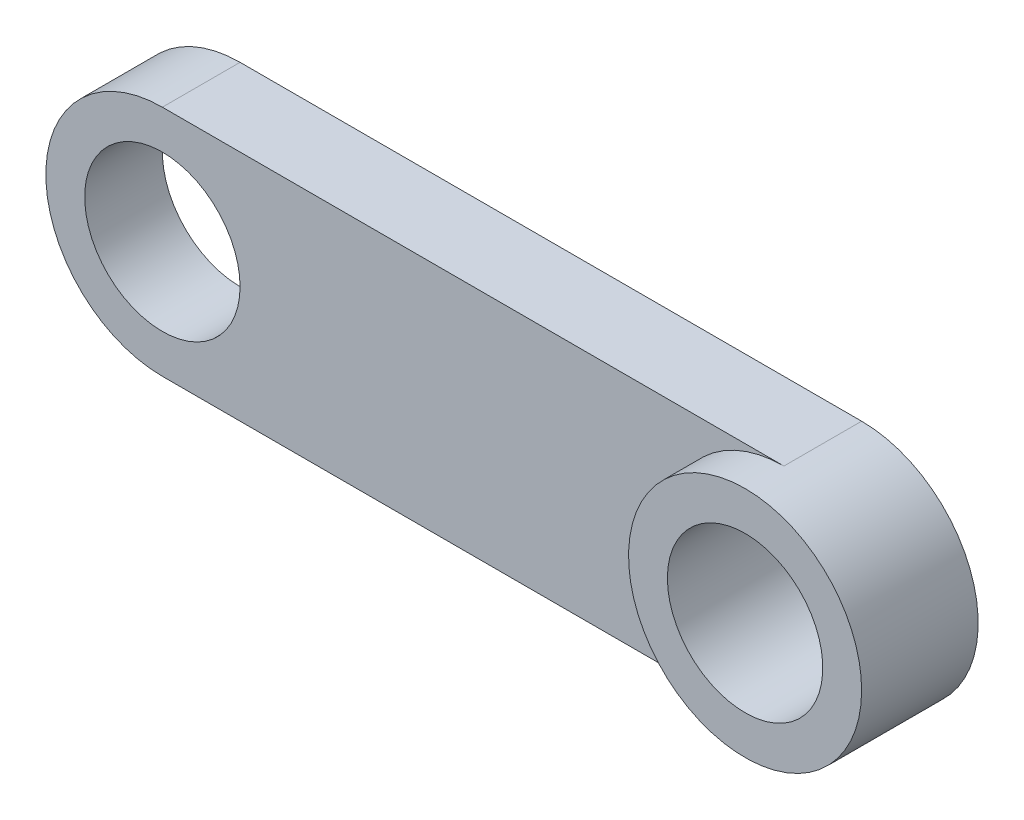
ISO-10303-21;
HEADER;
FILE_DESCRIPTION(('STEP AP214'),'2;1');
FILE_NAME('part.step','',(''),(''),'','','');
FILE_SCHEMA(('AUTOMOTIVE_DESIGN { 1 0 10303 214 1 1 1 1 }'));
ENDSEC;
DATA;
#1=APPLICATION_CONTEXT('core data for automotive mechanical design processes');
#2=APPLICATION_PROTOCOL_DEFINITION('international standard','automotive_design',2000,#1);
#3=PRODUCT_CONTEXT('',#1,'mechanical');
#4=PRODUCT('Part','Part','',(#3));
#5=PRODUCT_RELATED_PRODUCT_CATEGORY('part','',(#4));
#6=PRODUCT_DEFINITION_FORMATION('','',#4);
#7=PRODUCT_DEFINITION_CONTEXT('part definition',#1,'design');
#8=PRODUCT_DEFINITION('design','',#6,#7);
#9=PRODUCT_DEFINITION_SHAPE('','',#8);
#10=(LENGTH_UNIT() NAMED_UNIT(*) SI_UNIT(.MILLI.,.METRE.));
#11=(NAMED_UNIT(*) PLANE_ANGLE_UNIT() SI_UNIT($,.RADIAN.));
#12=(NAMED_UNIT(*) SI_UNIT($,.STERADIAN.) SOLID_ANGLE_UNIT());
#13=UNCERTAINTY_MEASURE_WITH_UNIT(LENGTH_MEASURE(1.E-05),#10,'distance_accuracy_value','');
#14=(GEOMETRIC_REPRESENTATION_CONTEXT(3) GLOBAL_UNCERTAINTY_ASSIGNED_CONTEXT((#13)) GLOBAL_UNIT_ASSIGNED_CONTEXT((#10,
#11,#12)) REPRESENTATION_CONTEXT('',''));
#15=CARTESIAN_POINT('',(0.,0.,0.));
#16=DIRECTION('',(0.,0.,1.));
#17=DIRECTION('',(1.,0.,0.));
#18=AXIS2_PLACEMENT_3D('',#15,#16,#17);
#19=CARTESIAN_POINT('',(-30.746408045977,1.04008620689656,6.35));
#20=DIRECTION('',(0.,0.,1.));
#21=DIRECTION('',(1.,0.,0.));
#22=AXIS2_PLACEMENT_3D('',#19,#20,#21);
#23=PLANE('',#22);
#24=CARTESIAN_POINT('',(20.053591954023,1.04008620689656,6.35));
#25=DIRECTION('',(0.,0.,1.));
#26=DIRECTION('',(1.,0.,0.));
#27=AXIS2_PLACEMENT_3D('',#24,#25,#26);
#28=CIRCLE('',#27,9.525);
#29=CARTESIAN_POINT('',(20.053591954023,10.5650862068966,6.35));
#30=VERTEX_POINT('',#29);
#31=CARTESIAN_POINT('',(20.053591954023,-8.48491379310344,6.35));
#32=VERTEX_POINT('',#31);
#33=EDGE_CURVE('E91',#30,#32,#28,.T.);
#34=ORIENTED_EDGE('',*,*,#33,.F.);
#35=DIRECTION('',(-1.,0.,0.));
#36=VECTOR('',#35,1.);
#37=CARTESIAN_POINT('',(-30.746408045977,10.5650862068966,6.35));
#38=LINE('',#37,#36);
#39=CARTESIAN_POINT('',(-30.746408045977,10.5650862068966,6.35));
#40=VERTEX_POINT('',#39);
#41=EDGE_CURVE('E52',#30,#40,#38,.T.);
#42=ORIENTED_EDGE('',*,*,#41,.T.);
#43=CARTESIAN_POINT('',(-30.746408045977,1.04008620689656,6.35));
#44=DIRECTION('',(0.,0.,1.));
#45=DIRECTION('',(1.,0.,0.));
#46=AXIS2_PLACEMENT_3D('',#43,#44,#45);
#47=CIRCLE('',#46,9.525);
#48=CARTESIAN_POINT('',(-30.746408045977,-8.48491379310344,6.35));
#49=VERTEX_POINT('',#48);
#50=EDGE_CURVE('E112',#40,#49,#47,.T.);
#51=ORIENTED_EDGE('',*,*,#50,.T.);
#52=DIRECTION('',(1.,0.,0.));
#53=VECTOR('',#52,1.);
#54=CARTESIAN_POINT('',(-30.746408045977,-8.48491379310344,6.35));
#55=LINE('',#54,#53);
#56=EDGE_CURVE('E81',#49,#32,#55,.T.);
#57=ORIENTED_EDGE('',*,*,#56,.T.);
#58=EDGE_LOOP('',(#34,#42,#51,#57));
#59=FACE_BOUND('',#58,.T.);
#60=CARTESIAN_POINT('',(-30.746408045977,1.04008620689656,6.35));
#61=DIRECTION('',(0.,0.,1.));
#62=DIRECTION('',(1.,0.,0.));
#63=AXIS2_PLACEMENT_3D('',#60,#61,#62);
#64=CIRCLE('',#63,6.35);
#65=CARTESIAN_POINT('',(-24.396408045977,1.04008620689656,6.35));
#66=VERTEX_POINT('',#65);
#67=EDGE_CURVE('E106',#66,#66,#64,.T.);
#68=ORIENTED_EDGE('',*,*,#67,.F.);
#69=EDGE_LOOP('',(#68));
#70=FACE_BOUND('',#69,.T.);
#71=ADVANCED_FACE('F35',(#59,#70),#23,.T.);
#72=CARTESIAN_POINT('',(-30.746408045977,1.04008620689656,0.));
#73=DIRECTION('',(0.,0.,1.));
#74=DIRECTION('',(1.,0.,0.));
#75=AXIS2_PLACEMENT_3D('',#72,#73,#74);
#76=PLANE('',#75);
#77=CARTESIAN_POINT('',(-30.746408045977,1.04008620689656,0.));
#78=DIRECTION('',(0.,0.,1.));
#79=DIRECTION('',(1.,0.,0.));
#80=AXIS2_PLACEMENT_3D('',#77,#78,#79);
#81=CIRCLE('',#80,9.525);
#82=CARTESIAN_POINT('',(-30.746408045977,10.5650862068966,0.));
#83=VERTEX_POINT('',#82);
#84=CARTESIAN_POINT('',(-30.746408045977,-8.48491379310344,0.));
#85=VERTEX_POINT('',#84);
#86=EDGE_CURVE('E109',#83,#85,#81,.T.);
#87=ORIENTED_EDGE('',*,*,#86,.F.);
#88=DIRECTION('',(-1.,0.,0.));
#89=VECTOR('',#88,1.);
#90=CARTESIAN_POINT('',(-30.746408045977,10.5650862068966,0.));
#91=LINE('',#90,#89);
#92=CARTESIAN_POINT('',(20.053591954023,10.5650862068966,0.));
#93=VERTEX_POINT('',#92);
#94=EDGE_CURVE('E76',#93,#83,#91,.T.);
#95=ORIENTED_EDGE('',*,*,#94,.F.);
#96=CARTESIAN_POINT('',(20.053591954023,1.04008620689656,0.));
#97=DIRECTION('',(0.,0.,1.));
#98=DIRECTION('',(-1.,0.,0.));
#99=AXIS2_PLACEMENT_3D('',#96,#97,#98);
#100=CIRCLE('',#99,9.525);
#101=CARTESIAN_POINT('',(20.053591954023,-8.48491379310344,0.));
#102=VERTEX_POINT('',#101);
#103=EDGE_CURVE('E71',#102,#93,#100,.T.);
#104=ORIENTED_EDGE('',*,*,#103,.F.);
#105=DIRECTION('',(1.,0.,0.));
#106=VECTOR('',#105,1.);
#107=CARTESIAN_POINT('',(-30.746408045977,-8.48491379310344,0.));
#108=LINE('',#107,#106);
#109=EDGE_CURVE('E117',#85,#102,#108,.T.);
#110=ORIENTED_EDGE('',*,*,#109,.F.);
#111=EDGE_LOOP('',(#87,#95,#104,#110));
#112=FACE_BOUND('',#111,.T.);
#113=CARTESIAN_POINT('',(-30.746408045977,1.04008620689656,0.));
#114=DIRECTION('',(0.,0.,1.));
#115=DIRECTION('',(1.,0.,0.));
#116=AXIS2_PLACEMENT_3D('',#113,#114,#115);
#117=CIRCLE('',#116,6.35);
#118=CARTESIAN_POINT('',(-24.396408045977,1.04008620689656,0.));
#119=VERTEX_POINT('',#118);
#120=EDGE_CURVE('E105',#119,#119,#117,.T.);
#121=ORIENTED_EDGE('',*,*,#120,.T.);
#122=EDGE_LOOP('',(#121));
#123=FACE_BOUND('',#122,.T.);
#124=CARTESIAN_POINT('',(20.053591954023,1.04008620689656,0.));
#125=DIRECTION('',(0.,0.,1.));
#126=DIRECTION('',(1.,0.,0.));
#127=AXIS2_PLACEMENT_3D('',#124,#125,#126);
#128=CIRCLE('',#127,6.35);
#129=CARTESIAN_POINT('',(26.403591954023,1.04008620689656,0.));
#130=VERTEX_POINT('',#129);
#131=EDGE_CURVE('E98',#130,#130,#128,.T.);
#132=ORIENTED_EDGE('',*,*,#131,.T.);
#133=EDGE_LOOP('',(#132));
#134=FACE_BOUND('',#133,.T.);
#135=ADVANCED_FACE('F123',(#112,#123,#134),#76,.F.);
#136=CARTESIAN_POINT('',(-30.746408045977,1.04008620689656,6.35));
#137=DIRECTION('',(0.,0.,-1.));
#138=DIRECTION('',(-1.,0.,0.));
#139=AXIS2_PLACEMENT_3D('',#136,#137,#138);
#140=CYLINDRICAL_SURFACE('',#139,9.525);
#141=ORIENTED_EDGE('',*,*,#86,.T.);
#142=DIRECTION('',(0.,0.,-1.));
#143=VECTOR('',#142,1.);
#144=CARTESIAN_POINT('',(-30.746408045977,-8.48491379310344,6.35));
#145=LINE('',#144,#143);
#146=EDGE_CURVE('E11',#49,#85,#145,.T.);
#147=ORIENTED_EDGE('',*,*,#146,.F.);
#148=ORIENTED_EDGE('',*,*,#50,.F.);
#149=DIRECTION('',(0.,0.,-1.));
#150=VECTOR('',#149,1.);
#151=CARTESIAN_POINT('',(-30.746408045977,10.5650862068966,6.35));
#152=LINE('',#151,#150);
#153=EDGE_CURVE('E85',#40,#83,#152,.T.);
#154=ORIENTED_EDGE('',*,*,#153,.T.);
#155=EDGE_LOOP('',(#141,#147,#148,#154));
#156=FACE_BOUND('',#155,.T.);
#157=ADVANCED_FACE('F37',(#156),#140,.T.);
#158=CARTESIAN_POINT('',(-30.746408045977,-8.48491379310344,6.35));
#159=DIRECTION('',(0.,1.,0.));
#160=DIRECTION('',(0.,0.,1.));
#161=AXIS2_PLACEMENT_3D('',#158,#159,#160);
#162=PLANE('',#161);
#163=ORIENTED_EDGE('',*,*,#109,.T.);
#164=DIRECTION('',(0.,0.,-1.));
#165=VECTOR('',#164,1.);
#166=CARTESIAN_POINT('',(20.053591954023,-8.48491379310344,6.35));
#167=LINE('',#166,#165);
#168=EDGE_CURVE('E44',#32,#102,#167,.T.);
#169=ORIENTED_EDGE('',*,*,#168,.F.);
#170=ORIENTED_EDGE('',*,*,#56,.F.);
#171=ORIENTED_EDGE('',*,*,#146,.T.);
#172=EDGE_LOOP('',(#163,#169,#170,#171));
#173=FACE_BOUND('',#172,.T.);
#174=ADVANCED_FACE('F127',(#173),#162,.F.);
#175=CARTESIAN_POINT('',(20.053591954023,1.04008620689656,6.35));
#176=DIRECTION('',(0.,0.,-1.));
#177=DIRECTION('',(-1.,0.,0.));
#178=AXIS2_PLACEMENT_3D('',#175,#176,#177);
#179=CYLINDRICAL_SURFACE('',#178,9.525);
#180=ORIENTED_EDGE('',*,*,#103,.T.);
#181=DIRECTION('',(0.,0.,-1.));
#182=VECTOR('',#181,1.);
#183=CARTESIAN_POINT('',(20.053591954023,10.5650862068966,6.35));
#184=LINE('',#183,#182);
#185=EDGE_CURVE('E84',#30,#93,#184,.T.);
#186=ORIENTED_EDGE('',*,*,#185,.F.);
#187=ORIENTED_EDGE('',*,*,#33,.T.);
#188=ORIENTED_EDGE('',*,*,#168,.T.);
#189=EDGE_LOOP('',(#180,#186,#187,#188));
#190=FACE_BOUND('',#189,.T.);
#191=CARTESIAN_POINT('',(20.053591954023,1.04008620689656,9.525));
#192=DIRECTION('',(0.,0.,1.));
#193=DIRECTION('',(1.,0.,0.));
#194=AXIS2_PLACEMENT_3D('',#191,#192,#193);
#195=CIRCLE('',#194,9.525);
#196=CARTESIAN_POINT('',(29.578591954023,1.04008620689656,9.525));
#197=VERTEX_POINT('',#196);
#198=EDGE_CURVE('E94',#197,#197,#195,.T.);
#199=ORIENTED_EDGE('',*,*,#198,.F.);
#200=EDGE_LOOP('',(#199));
#201=FACE_BOUND('',#200,.T.);
#202=ADVANCED_FACE('F89',(#190,#201),#179,.T.);
#203=CARTESIAN_POINT('',(-30.746408045977,10.5650862068966,6.35));
#204=DIRECTION('',(0.,-1.,0.));
#205=DIRECTION('',(0.,0.,-1.));
#206=AXIS2_PLACEMENT_3D('',#203,#204,#205);
#207=PLANE('',#206);
#208=ORIENTED_EDGE('',*,*,#94,.T.);
#209=ORIENTED_EDGE('',*,*,#153,.F.);
#210=ORIENTED_EDGE('',*,*,#41,.F.);
#211=ORIENTED_EDGE('',*,*,#185,.T.);
#212=EDGE_LOOP('',(#208,#209,#210,#211));
#213=FACE_BOUND('',#212,.T.);
#214=ADVANCED_FACE('F83',(#213),#207,.F.);
#215=CARTESIAN_POINT('',(-30.746408045977,1.04008620689656,6.35));
#216=DIRECTION('',(0.,0.,-1.));
#217=DIRECTION('',(-1.,0.,0.));
#218=AXIS2_PLACEMENT_3D('',#215,#216,#217);
#219=CYLINDRICAL_SURFACE('',#218,6.35);
#220=ORIENTED_EDGE('',*,*,#67,.T.);
#221=EDGE_LOOP('',(#220));
#222=FACE_BOUND('',#221,.T.);
#223=ORIENTED_EDGE('',*,*,#120,.F.);
#224=EDGE_LOOP('',(#223));
#225=FACE_BOUND('',#224,.T.);
#226=ADVANCED_FACE('F143',(#222,#225),#219,.F.);
#227=CARTESIAN_POINT('',(20.053591954023,1.04008620689656,6.35));
#228=DIRECTION('',(0.,0.,-1.));
#229=DIRECTION('',(-1.,0.,0.));
#230=AXIS2_PLACEMENT_3D('',#227,#228,#229);
#231=CYLINDRICAL_SURFACE('',#230,6.35);
#232=ORIENTED_EDGE('',*,*,#131,.F.);
#233=EDGE_LOOP('',(#232));
#234=FACE_BOUND('',#233,.T.);
#235=CARTESIAN_POINT('',(20.053591954023,1.04008620689656,9.525));
#236=DIRECTION('',(0.,0.,-1.));
#237=DIRECTION('',(-1.,0.,0.));
#238=AXIS2_PLACEMENT_3D('',#235,#236,#237);
#239=CIRCLE('',#238,6.35);
#240=CARTESIAN_POINT('',(13.703591954023,1.04008620689656,9.525));
#241=VERTEX_POINT('',#240);
#242=EDGE_CURVE('E95',#241,#241,#239,.T.);
#243=ORIENTED_EDGE('',*,*,#242,.F.);
#244=EDGE_LOOP('',(#243));
#245=FACE_BOUND('',#244,.T.);
#246=ADVANCED_FACE('F150',(#234,#245),#231,.F.);
#247=CARTESIAN_POINT('',(20.053591954023,1.04008620689656,9.525));
#248=DIRECTION('',(0.,0.,1.));
#249=DIRECTION('',(1.,0.,0.));
#250=AXIS2_PLACEMENT_3D('',#247,#248,#249);
#251=PLANE('',#250);
#252=ORIENTED_EDGE('',*,*,#242,.T.);
#253=EDGE_LOOP('',(#252));
#254=FACE_BOUND('',#253,.T.);
#255=ORIENTED_EDGE('',*,*,#198,.T.);
#256=EDGE_LOOP('',(#255));
#257=FACE_BOUND('',#256,.T.);
#258=ADVANCED_FACE('F154',(#254,#257),#251,.T.);
#259=CLOSED_SHELL('',(#71,#135,#157,#174,#202,#214,#226,#246,#258));
#260=MANIFOLD_SOLID_BREP('B2',#259);
#261=ADVANCED_BREP_SHAPE_REPRESENTATION('',(#18,#260),#14);
#262=SHAPE_DEFINITION_REPRESENTATION(#9,#261);
ENDSEC;
END-ISO-10303-21;
